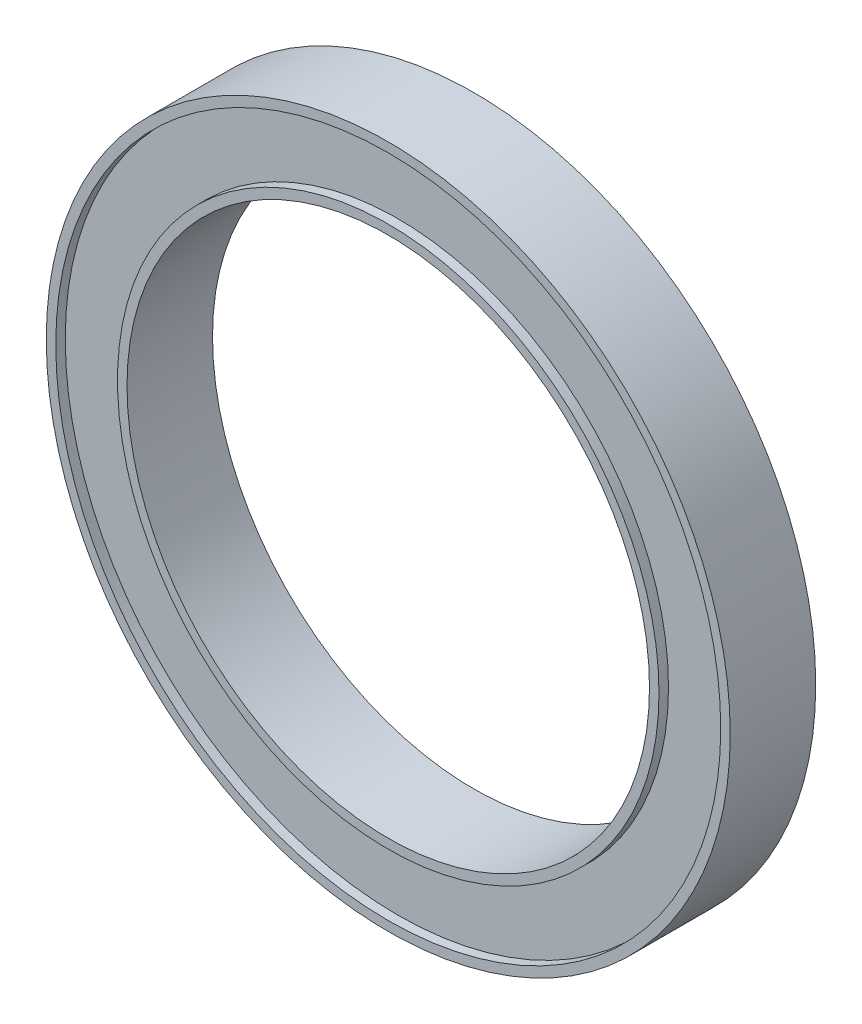
ISO-10303-21;
HEADER;
FILE_DESCRIPTION(('STEP AP214'),'2;1');
FILE_NAME('part.step','',(''),(''),'','','');
FILE_SCHEMA(('AUTOMOTIVE_DESIGN { 1 0 10303 214 1 1 1 1 }'));
ENDSEC;
DATA;
#1=APPLICATION_CONTEXT('core data for automotive mechanical design processes');
#2=APPLICATION_PROTOCOL_DEFINITION('international standard','automotive_design',2000,#1);
#3=PRODUCT_CONTEXT('',#1,'mechanical');
#4=PRODUCT('Part','Part','',(#3));
#5=PRODUCT_RELATED_PRODUCT_CATEGORY('part','',(#4));
#6=PRODUCT_DEFINITION_FORMATION('','',#4);
#7=PRODUCT_DEFINITION_CONTEXT('part definition',#1,'design');
#8=PRODUCT_DEFINITION('design','',#6,#7);
#9=PRODUCT_DEFINITION_SHAPE('','',#8);
#10=(LENGTH_UNIT() NAMED_UNIT(*) SI_UNIT(.MILLI.,.METRE.));
#11=(NAMED_UNIT(*) PLANE_ANGLE_UNIT() SI_UNIT($,.RADIAN.));
#12=(NAMED_UNIT(*) SI_UNIT($,.STERADIAN.) SOLID_ANGLE_UNIT());
#13=UNCERTAINTY_MEASURE_WITH_UNIT(LENGTH_MEASURE(1.E-05),#10,'distance_accuracy_value','');
#14=(GEOMETRIC_REPRESENTATION_CONTEXT(3) GLOBAL_UNCERTAINTY_ASSIGNED_CONTEXT((#13)) GLOBAL_UNIT_ASSIGNED_CONTEXT((#10,
#11,#12)) REPRESENTATION_CONTEXT('',''));
#15=CARTESIAN_POINT('',(0.,0.,0.));
#16=DIRECTION('',(0.,0.,1.));
#17=DIRECTION('',(1.,0.,0.));
#18=AXIS2_PLACEMENT_3D('',#15,#16,#17);
#19=CARTESIAN_POINT('',(0.,0.,-4.5));
#20=DIRECTION('',(0.,0.,1.));
#21=DIRECTION('',(1.,0.,0.));
#22=AXIS2_PLACEMENT_3D('',#19,#20,#21);
#23=PLANE('',#22);
#24=CARTESIAN_POINT('',(0.,0.,-4.5));
#25=DIRECTION('',(0.,0.,1.));
#26=DIRECTION('',(1.,0.,0.));
#27=AXIS2_PLACEMENT_3D('',#24,#25,#26);
#28=CIRCLE('',#27,27.5);
#29=CARTESIAN_POINT('',(27.5,0.,-4.5));
#30=VERTEX_POINT('',#29);
#31=EDGE_CURVE('E49',#30,#30,#28,.T.);
#32=ORIENTED_EDGE('',*,*,#31,.T.);
#33=EDGE_LOOP('',(#32));
#34=FACE_BOUND('',#33,.T.);
#35=CARTESIAN_POINT('',(0.,0.,-4.5));
#36=DIRECTION('',(0.,0.,1.));
#37=DIRECTION('',(1.,0.,0.));
#38=AXIS2_PLACEMENT_3D('',#35,#36,#37);
#39=CIRCLE('',#38,28.5);
#40=CARTESIAN_POINT('',(28.5,0.,-4.5));
#41=VERTEX_POINT('',#40);
#42=EDGE_CURVE('E73',#41,#41,#39,.T.);
#43=ORIENTED_EDGE('',*,*,#42,.F.);
#44=EDGE_LOOP('',(#43));
#45=FACE_BOUND('',#44,.T.);
#46=ADVANCED_FACE('F36',(#34,#45),#23,.F.);
#47=CARTESIAN_POINT('',(0.,0.,4.5));
#48=DIRECTION('',(0.,0.,1.));
#49=DIRECTION('',(1.,0.,0.));
#50=AXIS2_PLACEMENT_3D('',#47,#48,#49);
#51=PLANE('',#50);
#52=CARTESIAN_POINT('',(0.,0.,4.5));
#53=DIRECTION('',(0.,0.,1.));
#54=DIRECTION('',(1.,0.,0.));
#55=AXIS2_PLACEMENT_3D('',#52,#53,#54);
#56=CIRCLE('',#55,27.5);
#57=CARTESIAN_POINT('',(27.5,0.,4.5));
#58=VERTEX_POINT('',#57);
#59=EDGE_CURVE('E47',#58,#58,#56,.T.);
#60=ORIENTED_EDGE('',*,*,#59,.F.);
#61=EDGE_LOOP('',(#60));
#62=FACE_BOUND('',#61,.T.);
#63=CARTESIAN_POINT('',(0.,0.,4.5));
#64=DIRECTION('',(0.,0.,1.));
#65=DIRECTION('',(1.,0.,0.));
#66=AXIS2_PLACEMENT_3D('',#63,#64,#65);
#67=CIRCLE('',#66,28.5);
#68=CARTESIAN_POINT('',(28.5,0.,4.5));
#69=VERTEX_POINT('',#68);
#70=EDGE_CURVE('E61',#69,#69,#67,.T.);
#71=ORIENTED_EDGE('',*,*,#70,.T.);
#72=EDGE_LOOP('',(#71));
#73=FACE_BOUND('',#72,.T.);
#74=ADVANCED_FACE('F89',(#62,#73),#51,.T.);
#75=CARTESIAN_POINT('',(0.,0.,4.5));
#76=DIRECTION('',(0.,0.,1.));
#77=DIRECTION('',(1.,0.,0.));
#78=AXIS2_PLACEMENT_3D('',#75,#76,#77);
#79=CIRCLE('',#78,35.);
#80=CARTESIAN_POINT('',(35.,0.,4.5));
#81=VERTEX_POINT('',#80);
#82=EDGE_CURVE('E55',#81,#81,#79,.T.);
#83=ORIENTED_EDGE('',*,*,#82,.F.);
#84=EDGE_LOOP('',(#83));
#85=FACE_BOUND('',#84,.T.);
#86=CARTESIAN_POINT('',(0.,0.,4.5));
#87=DIRECTION('',(0.,0.,1.));
#88=DIRECTION('',(1.,0.,0.));
#89=AXIS2_PLACEMENT_3D('',#86,#87,#88);
#90=CIRCLE('',#89,36.);
#91=CARTESIAN_POINT('',(36.,0.,4.5));
#92=VERTEX_POINT('',#91);
#93=EDGE_CURVE('E10',#92,#92,#90,.T.);
#94=ORIENTED_EDGE('',*,*,#93,.T.);
#95=EDGE_LOOP('',(#94));
#96=FACE_BOUND('',#95,.T.);
#97=ADVANCED_FACE('F95',(#85,#96),#51,.T.);
#98=CARTESIAN_POINT('',(0.,0.,-4.5));
#99=DIRECTION('',(0.,0.,1.));
#100=DIRECTION('',(1.,0.,0.));
#101=AXIS2_PLACEMENT_3D('',#98,#99,#100);
#102=CIRCLE('',#101,35.);
#103=CARTESIAN_POINT('',(35.,0.,-4.5));
#104=VERTEX_POINT('',#103);
#105=EDGE_CURVE('E67',#104,#104,#102,.T.);
#106=ORIENTED_EDGE('',*,*,#105,.T.);
#107=EDGE_LOOP('',(#106));
#108=FACE_BOUND('',#107,.T.);
#109=CARTESIAN_POINT('',(0.,0.,-4.5));
#110=DIRECTION('',(0.,0.,1.));
#111=DIRECTION('',(1.,0.,0.));
#112=AXIS2_PLACEMENT_3D('',#109,#110,#111);
#113=CIRCLE('',#112,36.);
#114=CARTESIAN_POINT('',(36.,0.,-4.5));
#115=VERTEX_POINT('',#114);
#116=EDGE_CURVE('E40',#115,#115,#113,.T.);
#117=ORIENTED_EDGE('',*,*,#116,.F.);
#118=EDGE_LOOP('',(#117));
#119=FACE_BOUND('',#118,.T.);
#120=ADVANCED_FACE('F91',(#108,#119),#23,.F.);
#121=CARTESIAN_POINT('',(0.,0.,4.5));
#122=DIRECTION('',(0.,0.,-1.));
#123=DIRECTION('',(-1.,0.,0.));
#124=AXIS2_PLACEMENT_3D('',#121,#122,#123);
#125=CYLINDRICAL_SURFACE('',#124,36.);
#126=ORIENTED_EDGE('',*,*,#93,.F.);
#127=EDGE_LOOP('',(#126));
#128=FACE_BOUND('',#127,.T.);
#129=ORIENTED_EDGE('',*,*,#116,.T.);
#130=EDGE_LOOP('',(#129));
#131=FACE_BOUND('',#130,.T.);
#132=ADVANCED_FACE('F38',(#128,#131),#125,.T.);
#133=CARTESIAN_POINT('',(0.,0.,4.5));
#134=DIRECTION('',(0.,0.,-1.));
#135=DIRECTION('',(-1.,0.,0.));
#136=AXIS2_PLACEMENT_3D('',#133,#134,#135);
#137=CYLINDRICAL_SURFACE('',#136,27.5);
#138=ORIENTED_EDGE('',*,*,#59,.T.);
#139=EDGE_LOOP('',(#138));
#140=FACE_BOUND('',#139,.T.);
#141=ORIENTED_EDGE('',*,*,#31,.F.);
#142=EDGE_LOOP('',(#141));
#143=FACE_BOUND('',#142,.T.);
#144=ADVANCED_FACE('F104',(#140,#143),#137,.F.);
#145=CARTESIAN_POINT('',(0.,0.,3.5));
#146=DIRECTION('',(0.,0.,1.));
#147=DIRECTION('',(1.,0.,0.));
#148=AXIS2_PLACEMENT_3D('',#145,#146,#147);
#149=CYLINDRICAL_SURFACE('',#148,35.);
#150=CARTESIAN_POINT('',(0.,0.,3.5));
#151=DIRECTION('',(0.,0.,1.));
#152=DIRECTION('',(1.,0.,0.));
#153=AXIS2_PLACEMENT_3D('',#150,#151,#152);
#154=CIRCLE('',#153,35.);
#155=CARTESIAN_POINT('',(35.,0.,3.5));
#156=VERTEX_POINT('',#155);
#157=EDGE_CURVE('E52',#156,#156,#154,.T.);
#158=ORIENTED_EDGE('',*,*,#157,.F.);
#159=EDGE_LOOP('',(#158));
#160=FACE_BOUND('',#159,.T.);
#161=ORIENTED_EDGE('',*,*,#82,.T.);
#162=EDGE_LOOP('',(#161));
#163=FACE_BOUND('',#162,.T.);
#164=ADVANCED_FACE('F128',(#160,#163),#149,.F.);
#165=CARTESIAN_POINT('',(0.,0.,3.5));
#166=DIRECTION('',(0.,0.,1.));
#167=DIRECTION('',(1.,0.,0.));
#168=AXIS2_PLACEMENT_3D('',#165,#166,#167);
#169=PLANE('',#168);
#170=CARTESIAN_POINT('',(0.,0.,3.5));
#171=DIRECTION('',(0.,0.,1.));
#172=DIRECTION('',(1.,0.,0.));
#173=AXIS2_PLACEMENT_3D('',#170,#171,#172);
#174=CIRCLE('',#173,28.5);
#175=CARTESIAN_POINT('',(28.5,0.,3.5));
#176=VERTEX_POINT('',#175);
#177=EDGE_CURVE('E58',#176,#176,#174,.T.);
#178=ORIENTED_EDGE('',*,*,#177,.F.);
#179=EDGE_LOOP('',(#178));
#180=FACE_BOUND('',#179,.T.);
#181=ORIENTED_EDGE('',*,*,#157,.T.);
#182=EDGE_LOOP('',(#181));
#183=FACE_BOUND('',#182,.T.);
#184=ADVANCED_FACE('F124',(#180,#183),#169,.T.);
#185=CARTESIAN_POINT('',(0.,0.,3.5));
#186=DIRECTION('',(0.,0.,1.));
#187=DIRECTION('',(1.,0.,0.));
#188=AXIS2_PLACEMENT_3D('',#185,#186,#187);
#189=CYLINDRICAL_SURFACE('',#188,28.5);
#190=ORIENTED_EDGE('',*,*,#177,.T.);
#191=EDGE_LOOP('',(#190));
#192=FACE_BOUND('',#191,.T.);
#193=ORIENTED_EDGE('',*,*,#70,.F.);
#194=EDGE_LOOP('',(#193));
#195=FACE_BOUND('',#194,.T.);
#196=ADVANCED_FACE('F118',(#192,#195),#189,.T.);
#197=CARTESIAN_POINT('',(0.,0.,-3.5));
#198=DIRECTION('',(0.,0.,-1.));
#199=DIRECTION('',(1.,0.,0.));
#200=AXIS2_PLACEMENT_3D('',#197,#198,#199);
#201=PLANE('',#200);
#202=CARTESIAN_POINT('',(0.,0.,-3.5));
#203=DIRECTION('',(0.,0.,1.));
#204=DIRECTION('',(1.,0.,0.));
#205=AXIS2_PLACEMENT_3D('',#202,#203,#204);
#206=CIRCLE('',#205,35.);
#207=CARTESIAN_POINT('',(35.,0.,-3.5));
#208=VERTEX_POINT('',#207);
#209=EDGE_CURVE('E64',#208,#208,#206,.T.);
#210=ORIENTED_EDGE('',*,*,#209,.F.);
#211=EDGE_LOOP('',(#210));
#212=FACE_BOUND('',#211,.T.);
#213=CARTESIAN_POINT('',(0.,0.,-3.5));
#214=DIRECTION('',(0.,0.,1.));
#215=DIRECTION('',(1.,0.,0.));
#216=AXIS2_PLACEMENT_3D('',#213,#214,#215);
#217=CIRCLE('',#216,28.5);
#218=CARTESIAN_POINT('',(28.5,0.,-3.5));
#219=VERTEX_POINT('',#218);
#220=EDGE_CURVE('E70',#219,#219,#217,.T.);
#221=ORIENTED_EDGE('',*,*,#220,.T.);
#222=EDGE_LOOP('',(#221));
#223=FACE_BOUND('',#222,.T.);
#224=ADVANCED_FACE('F79',(#212,#223),#201,.T.);
#225=CARTESIAN_POINT('',(0.,0.,-3.5));
#226=DIRECTION('',(0.,0.,-1.));
#227=DIRECTION('',(-1.,0.,0.));
#228=AXIS2_PLACEMENT_3D('',#225,#226,#227);
#229=CYLINDRICAL_SURFACE('',#228,35.);
#230=ORIENTED_EDGE('',*,*,#209,.T.);
#231=EDGE_LOOP('',(#230));
#232=FACE_BOUND('',#231,.T.);
#233=ORIENTED_EDGE('',*,*,#105,.F.);
#234=EDGE_LOOP('',(#233));
#235=FACE_BOUND('',#234,.T.);
#236=ADVANCED_FACE('F84',(#232,#235),#229,.F.);
#237=CARTESIAN_POINT('',(0.,0.,-3.5));
#238=DIRECTION('',(0.,0.,-1.));
#239=DIRECTION('',(-1.,0.,0.));
#240=AXIS2_PLACEMENT_3D('',#237,#238,#239);
#241=CYLINDRICAL_SURFACE('',#240,28.5);
#242=ORIENTED_EDGE('',*,*,#220,.F.);
#243=EDGE_LOOP('',(#242));
#244=FACE_BOUND('',#243,.T.);
#245=ORIENTED_EDGE('',*,*,#42,.T.);
#246=EDGE_LOOP('',(#245));
#247=FACE_BOUND('',#246,.T.);
#248=ADVANCED_FACE('F81',(#244,#247),#241,.T.);
#249=CLOSED_SHELL('',(#46,#74,#97,#120,#132,#144,#164,#184,#196,#224,#236,#248));
#250=MANIFOLD_SOLID_BREP('B2',#249);
#251=ADVANCED_BREP_SHAPE_REPRESENTATION('',(#18,#250),#14);
#252=SHAPE_DEFINITION_REPRESENTATION(#9,#251);
ENDSEC;
END-ISO-10303-21;
